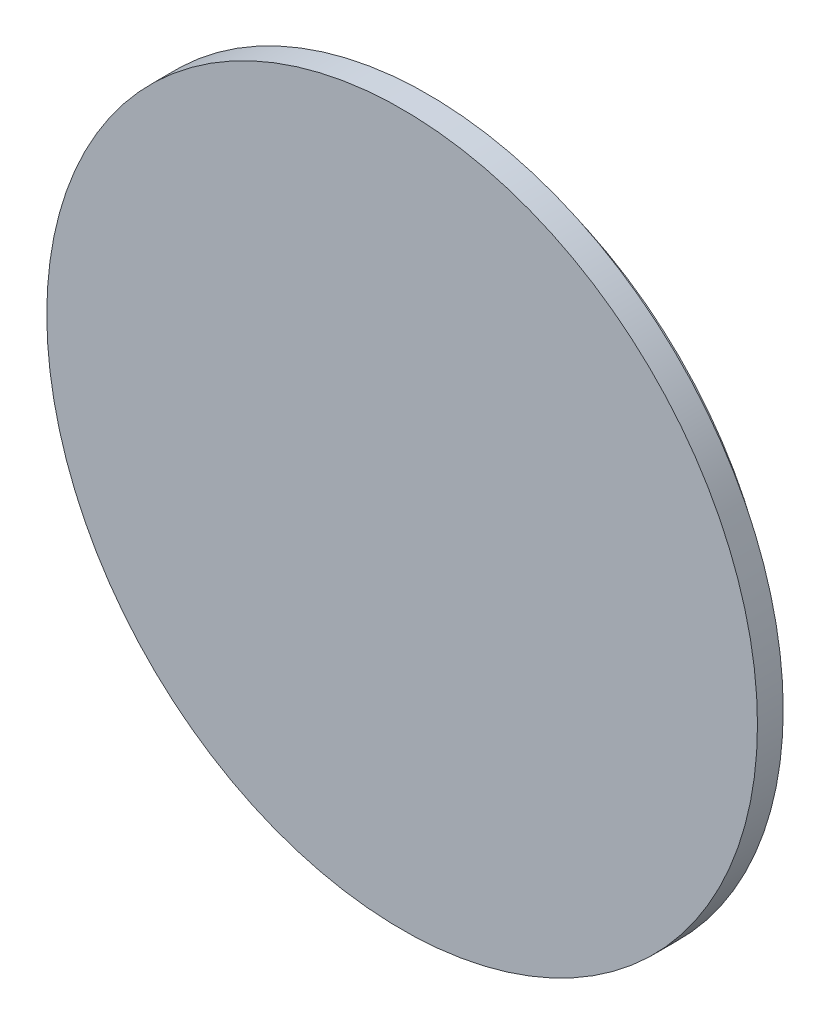
ISO-10303-21;
HEADER;
FILE_DESCRIPTION(('STEP AP214'),'2;1');
FILE_NAME('part.step','',(''),(''),'','','');
FILE_SCHEMA(('AUTOMOTIVE_DESIGN { 1 0 10303 214 1 1 1 1 }'));
ENDSEC;
DATA;
#1=APPLICATION_CONTEXT('core data for automotive mechanical design processes');
#2=APPLICATION_PROTOCOL_DEFINITION('international standard','automotive_design',2000,#1);
#3=PRODUCT_CONTEXT('',#1,'mechanical');
#4=PRODUCT('Part','Part','',(#3));
#5=PRODUCT_RELATED_PRODUCT_CATEGORY('part','',(#4));
#6=PRODUCT_DEFINITION_FORMATION('','',#4);
#7=PRODUCT_DEFINITION_CONTEXT('part definition',#1,'design');
#8=PRODUCT_DEFINITION('design','',#6,#7);
#9=PRODUCT_DEFINITION_SHAPE('','',#8);
#10=(LENGTH_UNIT() NAMED_UNIT(*) SI_UNIT(.MILLI.,.METRE.));
#11=(NAMED_UNIT(*) PLANE_ANGLE_UNIT() SI_UNIT($,.RADIAN.));
#12=(NAMED_UNIT(*) SI_UNIT($,.STERADIAN.) SOLID_ANGLE_UNIT());
#13=UNCERTAINTY_MEASURE_WITH_UNIT(LENGTH_MEASURE(1.E-05),#10,'distance_accuracy_value','');
#14=(GEOMETRIC_REPRESENTATION_CONTEXT(3) GLOBAL_UNCERTAINTY_ASSIGNED_CONTEXT((#13)) GLOBAL_UNIT_ASSIGNED_CONTEXT((#10,
#11,#12)) REPRESENTATION_CONTEXT('',''));
#15=CARTESIAN_POINT('',(0.,0.,0.));
#16=DIRECTION('',(0.,0.,1.));
#17=DIRECTION('',(1.,0.,0.));
#18=AXIS2_PLACEMENT_3D('',#15,#16,#17);
#19=CARTESIAN_POINT('',(0.,0.,0.));
#20=DIRECTION('',(0.,0.,1.));
#21=DIRECTION('',(1.,0.,0.));
#22=AXIS2_PLACEMENT_3D('',#19,#20,#21);
#23=PLANE('',#22);
#24=CARTESIAN_POINT('',(0.,0.,0.));
#25=DIRECTION('',(0.,0.,-1.));
#26=DIRECTION('',(-1.,0.,0.));
#27=AXIS2_PLACEMENT_3D('',#24,#25,#26);
#28=CIRCLE('',#27,31.85);
#29=CARTESIAN_POINT('',(-0.774999999975507,-31.8405696400055,0.));
#30=VERTEX_POINT('',#29);
#31=CARTESIAN_POINT('',(-0.774999999975507,31.8405696400055,0.));
#32=VERTEX_POINT('',#31);
#33=EDGE_CURVE('E94',#30,#32,#28,.T.);
#34=ORIENTED_EDGE('',*,*,#33,.T.);
#35=DIRECTION('',(0.,-1.,0.));
#36=VECTOR('',#35,1.);
#37=CARTESIAN_POINT('',(-0.774999999975507,0.,0.));
#38=LINE('',#37,#36);
#39=EDGE_CURVE('E59',#32,#30,#38,.T.);
#40=ORIENTED_EDGE('',*,*,#39,.T.);
#41=EDGE_LOOP('',(#34,#40));
#42=FACE_BOUND('',#41,.T.);
#43=ADVANCED_FACE('F36',(#42),#23,.F.);
#44=CARTESIAN_POINT('',(0.,0.,4.5));
#45=DIRECTION('',(0.,0.,-1.));
#46=DIRECTION('',(-1.,0.,0.));
#47=AXIS2_PLACEMENT_3D('',#44,#45,#46);
#48=CYLINDRICAL_SURFACE('',#47,34.5);
#49=CARTESIAN_POINT('',(0.,0.,4.5));
#50=DIRECTION('',(0.,0.,1.));
#51=DIRECTION('',(1.,0.,0.));
#52=AXIS2_PLACEMENT_3D('',#49,#50,#51);
#53=CIRCLE('',#52,34.5);
#54=CARTESIAN_POINT('',(34.5,0.,4.5));
#55=VERTEX_POINT('',#54);
#56=EDGE_CURVE('E82',#55,#55,#53,.T.);
#57=ORIENTED_EDGE('',*,*,#56,.F.);
#58=EDGE_LOOP('',(#57));
#59=FACE_BOUND('',#58,.T.);
#60=CARTESIAN_POINT('',(0.,0.,2.00000000000001));
#61=DIRECTION('',(0.,0.,-1.));
#62=DIRECTION('',(-1.,0.,0.));
#63=AXIS2_PLACEMENT_3D('',#60,#61,#62);
#64=CIRCLE('',#63,34.5);
#65=CARTESIAN_POINT('',(-34.5,0.,2.00000000000001));
#66=VERTEX_POINT('',#65);
#67=EDGE_CURVE('E97',#66,#66,#64,.T.);
#68=ORIENTED_EDGE('',*,*,#67,.F.);
#69=EDGE_LOOP('',(#68));
#70=FACE_BOUND('',#69,.T.);
#71=ADVANCED_FACE('F38',(#59,#70),#48,.T.);
#72=CARTESIAN_POINT('',(0.,0.,4.5));
#73=DIRECTION('',(0.,0.,1.));
#74=DIRECTION('',(1.,0.,0.));
#75=AXIS2_PLACEMENT_3D('',#72,#73,#74);
#76=PLANE('',#75);
#77=ORIENTED_EDGE('',*,*,#56,.T.);
#78=EDGE_LOOP('',(#77));
#79=FACE_BOUND('',#78,.T.);
#80=ADVANCED_FACE('F124',(#79),#76,.T.);
#81=CARTESIAN_POINT('',(34.5,0.,2.));
#82=DIRECTION('',(0.,0.,-1.));
#83=DIRECTION('',(-1.,0.,0.));
#84=AXIS2_PLACEMENT_3D('',#81,#82,#83);
#85=PLANE('',#84);
#86=ORIENTED_EDGE('',*,*,#67,.T.);
#87=EDGE_LOOP('',(#86));
#88=FACE_BOUND('',#87,.T.);
#89=CARTESIAN_POINT('',(0.,0.,2.00000000000001));
#90=DIRECTION('',(0.,0.,-1.));
#91=DIRECTION('',(-1.,0.,0.));
#92=AXIS2_PLACEMENT_3D('',#89,#90,#91);
#93=CIRCLE('',#92,31.85);
#94=CARTESIAN_POINT('',(-31.85,0.,2.00000000000001));
#95=VERTEX_POINT('',#94);
#96=EDGE_CURVE('E93',#95,#95,#93,.T.);
#97=ORIENTED_EDGE('',*,*,#96,.F.);
#98=EDGE_LOOP('',(#97));
#99=FACE_BOUND('',#98,.T.);
#100=ADVANCED_FACE('F133',(#88,#99),#85,.T.);
#101=CARTESIAN_POINT('',(0.,0.,0.));
#102=DIRECTION('',(0.,0.,-1.));
#103=DIRECTION('',(-1.,0.,0.));
#104=AXIS2_PLACEMENT_3D('',#101,#102,#103);
#105=CYLINDRICAL_SURFACE('',#104,31.85);
#106=DIRECTION('',(0.,0.,-1.));
#107=VECTOR('',#106,1.);
#108=CARTESIAN_POINT('',(-0.774999999975507,-31.8405696400055,0.));
#109=LINE('',#108,#107);
#110=CARTESIAN_POINT('',(-0.774999999975507,-31.8405696400055,1.5));
#111=VERTEX_POINT('',#110);
#112=EDGE_CURVE('E90',#111,#30,#109,.T.);
#113=ORIENTED_EDGE('',*,*,#112,.F.);
#114=CARTESIAN_POINT('',(0.,0.,1.5));
#115=DIRECTION('',(0.,0.,1.));
#116=DIRECTION('',(1.,0.,0.));
#117=AXIS2_PLACEMENT_3D('',#114,#115,#116);
#118=CIRCLE('',#117,31.85);
#119=CARTESIAN_POINT('',(0.775000000024493,-31.8405696400043,1.5));
#120=VERTEX_POINT('',#119);
#121=EDGE_CURVE('E11',#120,#111,#118,.F.);
#122=ORIENTED_EDGE('',*,*,#121,.F.);
#123=DIRECTION('',(0.,0.,-1.));
#124=VECTOR('',#123,1.);
#125=CARTESIAN_POINT('',(0.775000000024493,-31.8405696400043,0.));
#126=LINE('',#125,#124);
#127=CARTESIAN_POINT('',(0.775000000024493,-31.8405696400043,0.));
#128=VERTEX_POINT('',#127);
#129=EDGE_CURVE('E77',#128,#120,#126,.F.);
#130=ORIENTED_EDGE('',*,*,#129,.F.);
#131=CARTESIAN_POINT('',(0.775000000024493,31.8405696400043,0.));
#132=VERTEX_POINT('',#131);
#133=EDGE_CURVE('E89',#132,#128,#28,.T.);
#134=ORIENTED_EDGE('',*,*,#133,.F.);
#135=DIRECTION('',(0.,0.,-1.));
#136=VECTOR('',#135,1.);
#137=CARTESIAN_POINT('',(0.775000000024493,31.8405696400043,0.));
#138=LINE('',#137,#136);
#139=CARTESIAN_POINT('',(0.775000000024493,31.8405696400043,1.5));
#140=VERTEX_POINT('',#139);
#141=EDGE_CURVE('E51',#140,#132,#138,.T.);
#142=ORIENTED_EDGE('',*,*,#141,.F.);
#143=CARTESIAN_POINT('',(-0.774999999975507,31.8405696400055,1.5));
#144=VERTEX_POINT('',#143);
#145=EDGE_CURVE('E40',#144,#140,#118,.F.);
#146=ORIENTED_EDGE('',*,*,#145,.F.);
#147=DIRECTION('',(0.,0.,-1.));
#148=VECTOR('',#147,1.);
#149=CARTESIAN_POINT('',(-0.774999999975507,31.8405696400055,0.));
#150=LINE('',#149,#148);
#151=EDGE_CURVE('E100',#32,#144,#150,.F.);
#152=ORIENTED_EDGE('',*,*,#151,.F.);
#153=ORIENTED_EDGE('',*,*,#33,.F.);
#154=EDGE_LOOP('',(#113,#122,#130,#134,#142,#146,#152,#153));
#155=FACE_BOUND('',#154,.T.);
#156=ORIENTED_EDGE('',*,*,#96,.T.);
#157=EDGE_LOOP('',(#156));
#158=FACE_BOUND('',#157,.T.);
#159=ADVANCED_FACE('F87',(#155,#158),#105,.T.);
#160=ORIENTED_EDGE('',*,*,#133,.T.);
#161=DIRECTION('',(0.,1.,0.));
#162=VECTOR('',#161,1.);
#163=CARTESIAN_POINT('',(0.775000000024493,0.,0.));
#164=LINE('',#163,#162);
#165=EDGE_CURVE('E74',#128,#132,#164,.T.);
#166=ORIENTED_EDGE('',*,*,#165,.T.);
#167=EDGE_LOOP('',(#160,#166));
#168=FACE_BOUND('',#167,.T.);
#169=ADVANCED_FACE('F92',(#168),#23,.F.);
#170=CARTESIAN_POINT('',(-0.774999999975507,-34.5,0.));
#171=DIRECTION('',(-1.,0.,0.));
#172=DIRECTION('',(0.,0.,1.));
#173=AXIS2_PLACEMENT_3D('',#170,#171,#172);
#174=PLANE('',#173);
#175=ORIENTED_EDGE('',*,*,#151,.T.);
#176=DIRECTION('',(0.,1.,0.));
#177=VECTOR('',#176,1.);
#178=CARTESIAN_POINT('',(-0.774999999975507,-34.5,1.5));
#179=LINE('',#178,#177);
#180=EDGE_CURVE('E115',#111,#144,#179,.T.);
#181=ORIENTED_EDGE('',*,*,#180,.F.);
#182=ORIENTED_EDGE('',*,*,#112,.T.);
#183=ORIENTED_EDGE('',*,*,#39,.F.);
#184=EDGE_LOOP('',(#175,#181,#182,#183));
#185=FACE_BOUND('',#184,.T.);
#186=ADVANCED_FACE('F119',(#185),#174,.F.);
#187=CARTESIAN_POINT('',(0.775000000024493,-34.5,0.));
#188=DIRECTION('',(1.,0.,0.));
#189=DIRECTION('',(0.,0.,-1.));
#190=AXIS2_PLACEMENT_3D('',#187,#188,#189);
#191=PLANE('',#190);
#192=ORIENTED_EDGE('',*,*,#129,.T.);
#193=DIRECTION('',(0.,1.,0.));
#194=VECTOR('',#193,1.);
#195=CARTESIAN_POINT('',(0.775000000024493,-34.5,1.5));
#196=LINE('',#195,#194);
#197=EDGE_CURVE('E113',#120,#140,#196,.T.);
#198=ORIENTED_EDGE('',*,*,#197,.T.);
#199=ORIENTED_EDGE('',*,*,#141,.T.);
#200=ORIENTED_EDGE('',*,*,#165,.F.);
#201=EDGE_LOOP('',(#192,#198,#199,#200));
#202=FACE_BOUND('',#201,.T.);
#203=ADVANCED_FACE('F76',(#202),#191,.F.);
#204=CARTESIAN_POINT('',(-0.774999999975507,-34.5,1.5));
#205=DIRECTION('',(0.,0.,1.));
#206=DIRECTION('',(1.,0.,0.));
#207=AXIS2_PLACEMENT_3D('',#204,#205,#206);
#208=PLANE('',#207);
#209=ORIENTED_EDGE('',*,*,#121,.T.);
#210=ORIENTED_EDGE('',*,*,#180,.T.);
#211=ORIENTED_EDGE('',*,*,#145,.T.);
#212=ORIENTED_EDGE('',*,*,#197,.F.);
#213=EDGE_LOOP('',(#209,#210,#211,#212));
#214=FACE_BOUND('',#213,.T.);
#215=ADVANCED_FACE('F112',(#214),#208,.F.);
#216=CLOSED_SHELL('',(#43,#71,#80,#100,#159,#169,#186,#203,#215));
#217=MANIFOLD_SOLID_BREP('B2',#216);
#218=ADVANCED_BREP_SHAPE_REPRESENTATION('',(#18,#217),#14);
#219=SHAPE_DEFINITION_REPRESENTATION(#9,#218);
ENDSEC;
END-ISO-10303-21;
